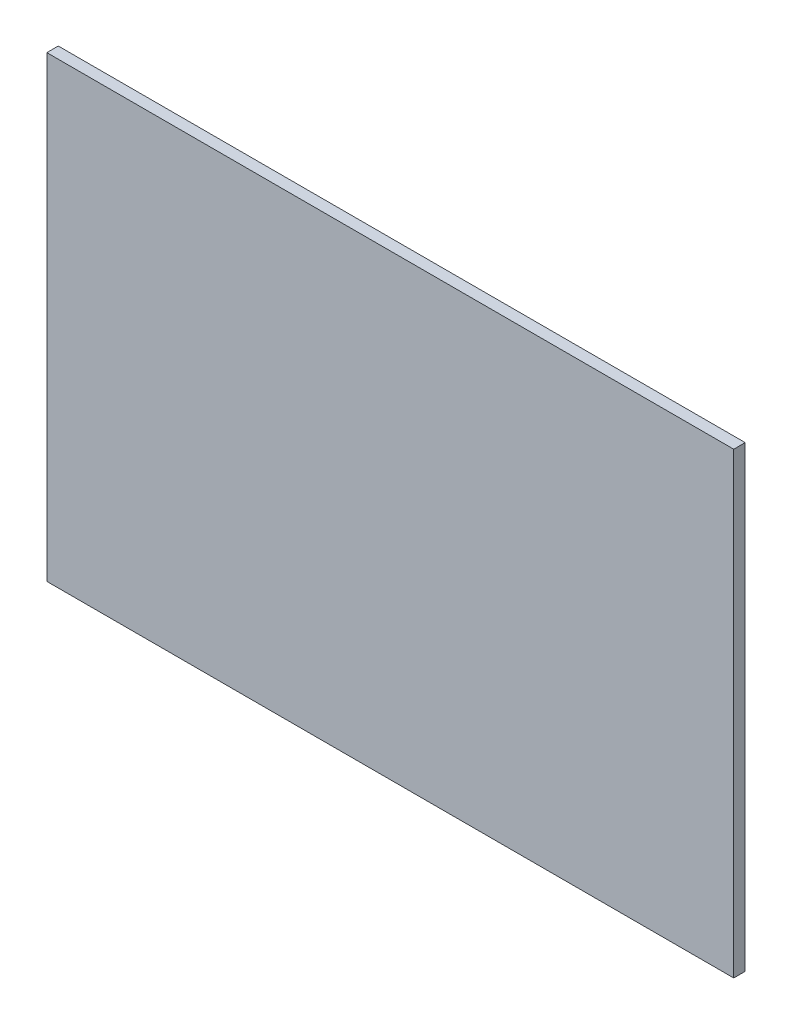
ISO-10303-21;
HEADER;
FILE_DESCRIPTION(('STEP AP214'),'2;1');
FILE_NAME('part.step','',(''),(''),'','','');
FILE_SCHEMA(('AUTOMOTIVE_DESIGN { 1 0 10303 214 1 1 1 1 }'));
ENDSEC;
DATA;
#1=APPLICATION_CONTEXT('core data for automotive mechanical design processes');
#2=APPLICATION_PROTOCOL_DEFINITION('international standard','automotive_design',2000,#1);
#3=PRODUCT_CONTEXT('',#1,'mechanical');
#4=PRODUCT('Part','Part','',(#3));
#5=PRODUCT_RELATED_PRODUCT_CATEGORY('part','',(#4));
#6=PRODUCT_DEFINITION_FORMATION('','',#4);
#7=PRODUCT_DEFINITION_CONTEXT('part definition',#1,'design');
#8=PRODUCT_DEFINITION('design','',#6,#7);
#9=PRODUCT_DEFINITION_SHAPE('','',#8);
#10=(LENGTH_UNIT() NAMED_UNIT(*) SI_UNIT(.MILLI.,.METRE.));
#11=(NAMED_UNIT(*) PLANE_ANGLE_UNIT() SI_UNIT($,.RADIAN.));
#12=(NAMED_UNIT(*) SI_UNIT($,.STERADIAN.) SOLID_ANGLE_UNIT());
#13=UNCERTAINTY_MEASURE_WITH_UNIT(LENGTH_MEASURE(1.E-05),#10,'distance_accuracy_value','');
#14=(GEOMETRIC_REPRESENTATION_CONTEXT(3) GLOBAL_UNCERTAINTY_ASSIGNED_CONTEXT((#13)) GLOBAL_UNIT_ASSIGNED_CONTEXT((#10,
#11,#12)) REPRESENTATION_CONTEXT('',''));
#15=CARTESIAN_POINT('',(0.,0.,0.));
#16=DIRECTION('',(0.,0.,1.));
#17=DIRECTION('',(1.,0.,0.));
#18=AXIS2_PLACEMENT_3D('',#15,#16,#17);
#19=CARTESIAN_POINT('',(90.,60.,3.));
#20=DIRECTION('',(-1.,0.,0.));
#21=DIRECTION('',(0.,-1.,0.));
#22=AXIS2_PLACEMENT_3D('',#19,#20,#21);
#23=PLANE('',#22);
#24=DIRECTION('',(0.,1.,0.));
#25=VECTOR('',#24,1.);
#26=CARTESIAN_POINT('',(90.,60.,0.));
#27=LINE('',#26,#25);
#28=CARTESIAN_POINT('',(90.,-60.,0.));
#29=VERTEX_POINT('',#28);
#30=CARTESIAN_POINT('',(90.,60.,0.));
#31=VERTEX_POINT('',#30);
#32=EDGE_CURVE('E96',#29,#31,#27,.T.);
#33=ORIENTED_EDGE('',*,*,#32,.T.);
#34=DIRECTION('',(0.,0.,-1.));
#35=VECTOR('',#34,1.);
#36=CARTESIAN_POINT('',(90.,60.,3.));
#37=LINE('',#36,#35);
#38=CARTESIAN_POINT('',(90.,60.,3.));
#39=VERTEX_POINT('',#38);
#40=EDGE_CURVE('E11',#39,#31,#37,.T.);
#41=ORIENTED_EDGE('',*,*,#40,.F.);
#42=DIRECTION('',(0.,1.,0.));
#43=VECTOR('',#42,1.);
#44=CARTESIAN_POINT('',(90.,60.,3.));
#45=LINE('',#44,#43);
#46=CARTESIAN_POINT('',(90.,-60.,3.));
#47=VERTEX_POINT('',#46);
#48=EDGE_CURVE('E84',#47,#39,#45,.T.);
#49=ORIENTED_EDGE('',*,*,#48,.F.);
#50=DIRECTION('',(0.,0.,-1.));
#51=VECTOR('',#50,1.);
#52=CARTESIAN_POINT('',(90.,-60.,3.));
#53=LINE('',#52,#51);
#54=EDGE_CURVE('E92',#47,#29,#53,.T.);
#55=ORIENTED_EDGE('',*,*,#54,.T.);
#56=EDGE_LOOP('',(#33,#41,#49,#55));
#57=FACE_BOUND('',#56,.T.);
#58=ADVANCED_FACE('F33',(#57),#23,.F.);
#59=CARTESIAN_POINT('',(-90.,60.,3.));
#60=DIRECTION('',(0.,-1.,0.));
#61=DIRECTION('',(0.,0.,-1.));
#62=AXIS2_PLACEMENT_3D('',#59,#60,#61);
#63=PLANE('',#62);
#64=DIRECTION('',(-1.,0.,0.));
#65=VECTOR('',#64,1.);
#66=CARTESIAN_POINT('',(-90.,60.,0.));
#67=LINE('',#66,#65);
#68=CARTESIAN_POINT('',(-90.,60.,0.));
#69=VERTEX_POINT('',#68);
#70=EDGE_CURVE('E88',#31,#69,#67,.T.);
#71=ORIENTED_EDGE('',*,*,#70,.T.);
#72=DIRECTION('',(0.,0.,-1.));
#73=VECTOR('',#72,1.);
#74=CARTESIAN_POINT('',(-90.,60.,3.));
#75=LINE('',#74,#73);
#76=CARTESIAN_POINT('',(-90.,60.,3.));
#77=VERTEX_POINT('',#76);
#78=EDGE_CURVE('E41',#77,#69,#75,.T.);
#79=ORIENTED_EDGE('',*,*,#78,.F.);
#80=DIRECTION('',(-1.,0.,0.));
#81=VECTOR('',#80,1.);
#82=CARTESIAN_POINT('',(-90.,60.,3.));
#83=LINE('',#82,#81);
#84=EDGE_CURVE('E79',#39,#77,#83,.T.);
#85=ORIENTED_EDGE('',*,*,#84,.F.);
#86=ORIENTED_EDGE('',*,*,#40,.T.);
#87=EDGE_LOOP('',(#71,#79,#85,#86));
#88=FACE_BOUND('',#87,.T.);
#89=ADVANCED_FACE('F87',(#88),#63,.F.);
#90=CARTESIAN_POINT('',(-90.,60.,3.));
#91=DIRECTION('',(1.,0.,0.));
#92=DIRECTION('',(0.,1.,0.));
#93=AXIS2_PLACEMENT_3D('',#90,#91,#92);
#94=PLANE('',#93);
#95=DIRECTION('',(0.,-1.,0.));
#96=VECTOR('',#95,1.);
#97=CARTESIAN_POINT('',(-90.,60.,0.));
#98=LINE('',#97,#96);
#99=CARTESIAN_POINT('',(-90.,-60.,0.));
#100=VERTEX_POINT('',#99);
#101=EDGE_CURVE('E66',#69,#100,#98,.T.);
#102=ORIENTED_EDGE('',*,*,#101,.T.);
#103=DIRECTION('',(0.,0.,-1.));
#104=VECTOR('',#103,1.);
#105=CARTESIAN_POINT('',(-90.,-60.,3.));
#106=LINE('',#105,#104);
#107=CARTESIAN_POINT('',(-90.,-60.,3.));
#108=VERTEX_POINT('',#107);
#109=EDGE_CURVE('E89',#108,#100,#106,.T.);
#110=ORIENTED_EDGE('',*,*,#109,.F.);
#111=DIRECTION('',(0.,-1.,0.));
#112=VECTOR('',#111,1.);
#113=CARTESIAN_POINT('',(-90.,60.,3.));
#114=LINE('',#113,#112);
#115=EDGE_CURVE('E82',#77,#108,#114,.T.);
#116=ORIENTED_EDGE('',*,*,#115,.F.);
#117=ORIENTED_EDGE('',*,*,#78,.T.);
#118=EDGE_LOOP('',(#102,#110,#116,#117));
#119=FACE_BOUND('',#118,.T.);
#120=ADVANCED_FACE('F90',(#119),#94,.F.);
#121=CARTESIAN_POINT('',(-90.,-60.,3.));
#122=DIRECTION('',(0.,1.,0.));
#123=DIRECTION('',(0.,0.,1.));
#124=AXIS2_PLACEMENT_3D('',#121,#122,#123);
#125=PLANE('',#124);
#126=DIRECTION('',(1.,0.,0.));
#127=VECTOR('',#126,1.);
#128=CARTESIAN_POINT('',(-90.,-60.,0.));
#129=LINE('',#128,#127);
#130=EDGE_CURVE('E72',#100,#29,#129,.T.);
#131=ORIENTED_EDGE('',*,*,#130,.T.);
#132=ORIENTED_EDGE('',*,*,#54,.F.);
#133=DIRECTION('',(1.,0.,0.));
#134=VECTOR('',#133,1.);
#135=CARTESIAN_POINT('',(-90.,-60.,3.));
#136=LINE('',#135,#134);
#137=EDGE_CURVE('E49',#108,#47,#136,.T.);
#138=ORIENTED_EDGE('',*,*,#137,.F.);
#139=ORIENTED_EDGE('',*,*,#109,.T.);
#140=EDGE_LOOP('',(#131,#132,#138,#139));
#141=FACE_BOUND('',#140,.T.);
#142=ADVANCED_FACE('F103',(#141),#125,.F.);
#143=CARTESIAN_POINT('',(0.,0.,3.));
#144=DIRECTION('',(0.,0.,1.));
#145=DIRECTION('',(1.,0.,0.));
#146=AXIS2_PLACEMENT_3D('',#143,#144,#145);
#147=PLANE('',#146);
#148=ORIENTED_EDGE('',*,*,#48,.T.);
#149=ORIENTED_EDGE('',*,*,#84,.T.);
#150=ORIENTED_EDGE('',*,*,#115,.T.);
#151=ORIENTED_EDGE('',*,*,#137,.T.);
#152=EDGE_LOOP('',(#148,#149,#150,#151));
#153=FACE_BOUND('',#152,.T.);
#154=ADVANCED_FACE('F80',(#153),#147,.T.);
#155=CARTESIAN_POINT('',(0.,0.,0.));
#156=DIRECTION('',(0.,0.,1.));
#157=DIRECTION('',(1.,0.,0.));
#158=AXIS2_PLACEMENT_3D('',#155,#156,#157);
#159=PLANE('',#158);
#160=ORIENTED_EDGE('',*,*,#32,.F.);
#161=ORIENTED_EDGE('',*,*,#130,.F.);
#162=ORIENTED_EDGE('',*,*,#101,.F.);
#163=ORIENTED_EDGE('',*,*,#70,.F.);
#164=EDGE_LOOP('',(#160,#161,#162,#163));
#165=FACE_BOUND('',#164,.T.);
#166=ADVANCED_FACE('F106',(#165),#159,.F.);
#167=CLOSED_SHELL('',(#58,#89,#120,#142,#154,#166));
#168=MANIFOLD_SOLID_BREP('B2',#167);
#169=ADVANCED_BREP_SHAPE_REPRESENTATION('',(#18,#168),#14);
#170=SHAPE_DEFINITION_REPRESENTATION(#9,#169);
ENDSEC;
END-ISO-10303-21;
